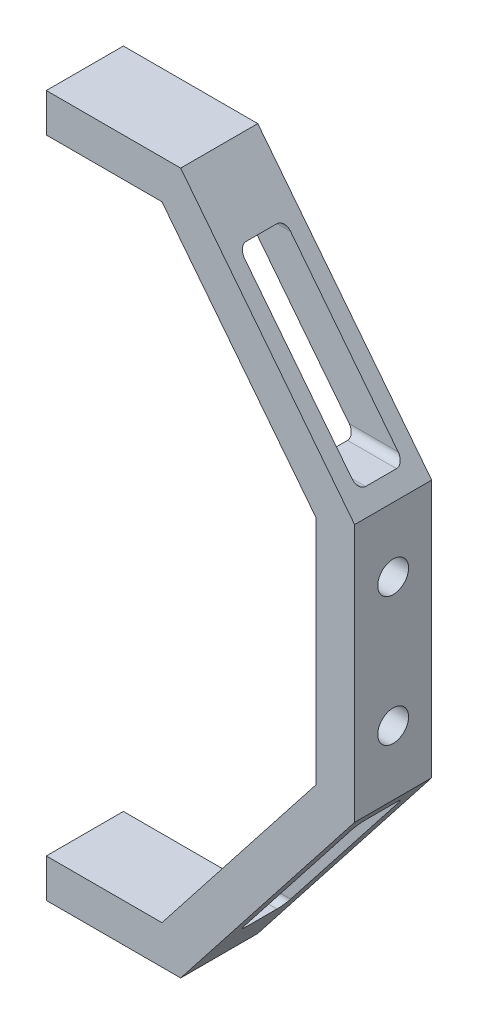
ISO-10303-21;
HEADER;
FILE_DESCRIPTION(('STEP AP214'),'2;1');
FILE_NAME('part.step','',(''),(''),'','','');
FILE_SCHEMA(('AUTOMOTIVE_DESIGN { 1 0 10303 214 1 1 1 1 }'));
ENDSEC;
DATA;
#1=APPLICATION_CONTEXT('core data for automotive mechanical design processes');
#2=APPLICATION_PROTOCOL_DEFINITION('international standard','automotive_design',2000,#1);
#3=PRODUCT_CONTEXT('',#1,'mechanical');
#4=PRODUCT('Part','Part','',(#3));
#5=PRODUCT_RELATED_PRODUCT_CATEGORY('part','',(#4));
#6=PRODUCT_DEFINITION_FORMATION('','',#4);
#7=PRODUCT_DEFINITION_CONTEXT('part definition',#1,'design');
#8=PRODUCT_DEFINITION('design','',#6,#7);
#9=PRODUCT_DEFINITION_SHAPE('','',#8);
#10=(LENGTH_UNIT() NAMED_UNIT(*) SI_UNIT(.MILLI.,.METRE.));
#11=(NAMED_UNIT(*) PLANE_ANGLE_UNIT() SI_UNIT($,.RADIAN.));
#12=(NAMED_UNIT(*) SI_UNIT($,.STERADIAN.) SOLID_ANGLE_UNIT());
#13=UNCERTAINTY_MEASURE_WITH_UNIT(LENGTH_MEASURE(1.E-05),#10,'distance_accuracy_value','');
#14=(GEOMETRIC_REPRESENTATION_CONTEXT(3) GLOBAL_UNCERTAINTY_ASSIGNED_CONTEXT((#13)) GLOBAL_UNIT_ASSIGNED_CONTEXT((#10,
#11,#12)) REPRESENTATION_CONTEXT('',''));
#15=CARTESIAN_POINT('',(0.,0.,0.));
#16=DIRECTION('',(0.,0.,1.));
#17=DIRECTION('',(1.,0.,0.));
#18=AXIS2_PLACEMENT_3D('',#15,#16,#17);
#19=CARTESIAN_POINT('',(0.,177.,20.));
#20=DIRECTION('',(0.,-1.,0.));
#21=DIRECTION('',(0.,0.,-1.));
#22=AXIS2_PLACEMENT_3D('',#19,#20,#21);
#23=PLANE('',#22);
#24=DIRECTION('',(-1.,0.,0.));
#25=VECTOR('',#24,1.);
#26=CARTESIAN_POINT('',(0.,177.,0.));
#27=LINE('',#26,#25);
#28=CARTESIAN_POINT('',(34.8657101357638,177.,0.));
#29=VERTEX_POINT('',#28);
#30=CARTESIAN_POINT('',(0.,177.,0.));
#31=VERTEX_POINT('',#30);
#32=EDGE_CURVE('E293',#29,#31,#27,.T.);
#33=ORIENTED_EDGE('',*,*,#32,.T.);
#34=DIRECTION('',(0.,0.,-1.));
#35=VECTOR('',#34,1.);
#36=CARTESIAN_POINT('',(0.,177.,20.));
#37=LINE('',#36,#35);
#38=CARTESIAN_POINT('',(0.,177.,20.));
#39=VERTEX_POINT('',#38);
#40=EDGE_CURVE('E384',#39,#31,#37,.T.);
#41=ORIENTED_EDGE('',*,*,#40,.F.);
#42=DIRECTION('',(-1.,0.,0.));
#43=VECTOR('',#42,1.);
#44=CARTESIAN_POINT('',(0.,177.,20.));
#45=LINE('',#44,#43);
#46=CARTESIAN_POINT('',(34.8657101357638,177.,20.));
#47=VERTEX_POINT('',#46);
#48=EDGE_CURVE('E302',#47,#39,#45,.T.);
#49=ORIENTED_EDGE('',*,*,#48,.F.);
#50=DIRECTION('',(0.,0.,-1.));
#51=VECTOR('',#50,1.);
#52=CARTESIAN_POINT('',(34.8657101357638,177.,20.));
#53=LINE('',#52,#51);
#54=EDGE_CURVE('E328',#47,#29,#53,.T.);
#55=ORIENTED_EDGE('',*,*,#54,.T.);
#56=EDGE_LOOP('',(#33,#41,#49,#55));
#57=FACE_BOUND('',#56,.T.);
#58=ADVANCED_FACE('F40',(#57),#23,.F.);
#59=CARTESIAN_POINT('',(0.,177.,20.));
#60=DIRECTION('',(1.,0.,0.));
#61=DIRECTION('',(0.,1.,0.));
#62=AXIS2_PLACEMENT_3D('',#59,#60,#61);
#63=PLANE('',#62);
#64=CARTESIAN_POINT('',(0.,172.,10.));
#65=DIRECTION('',(-1.,0.,0.));
#66=DIRECTION('',(0.,-1.,0.));
#67=AXIS2_PLACEMENT_3D('',#64,#65,#66);
#68=CIRCLE('',#67,4.);
#69=CARTESIAN_POINT('',(0.,168.,10.));
#70=VERTEX_POINT('',#69);
#71=EDGE_CURVE('E294',#70,#70,#68,.T.);
#72=ORIENTED_EDGE('',*,*,#71,.F.);
#73=EDGE_LOOP('',(#72));
#74=FACE_BOUND('',#73,.T.);
#75=DIRECTION('',(0.,-1.,0.));
#76=VECTOR('',#75,1.);
#77=CARTESIAN_POINT('',(0.,177.,0.));
#78=LINE('',#77,#76);
#79=CARTESIAN_POINT('',(0.,167.,0.));
#80=VERTEX_POINT('',#79);
#81=EDGE_CURVE('E331',#31,#80,#78,.T.);
#82=ORIENTED_EDGE('',*,*,#81,.T.);
#83=DIRECTION('',(0.,0.,-1.));
#84=VECTOR('',#83,1.);
#85=CARTESIAN_POINT('',(0.,167.,20.));
#86=LINE('',#85,#84);
#87=CARTESIAN_POINT('',(0.,167.,20.));
#88=VERTEX_POINT('',#87);
#89=EDGE_CURVE('E381',#88,#80,#86,.T.);
#90=ORIENTED_EDGE('',*,*,#89,.F.);
#91=DIRECTION('',(0.,-1.,0.));
#92=VECTOR('',#91,1.);
#93=CARTESIAN_POINT('',(0.,177.,20.));
#94=LINE('',#93,#92);
#95=EDGE_CURVE('E305',#39,#88,#94,.T.);
#96=ORIENTED_EDGE('',*,*,#95,.F.);
#97=ORIENTED_EDGE('',*,*,#40,.T.);
#98=EDGE_LOOP('',(#82,#90,#96,#97));
#99=FACE_BOUND('',#98,.T.);
#100=ADVANCED_FACE('F517',(#74,#99),#63,.F.);
#101=CARTESIAN_POINT('',(0.,167.,20.));
#102=DIRECTION('',(0.,1.,0.));
#103=DIRECTION('',(0.,0.,1.));
#104=AXIS2_PLACEMENT_3D('',#101,#102,#103);
#105=PLANE('',#104);
#106=DIRECTION('',(1.,0.,0.));
#107=VECTOR('',#106,1.);
#108=CARTESIAN_POINT('',(0.,167.,0.));
#109=LINE('',#108,#107);
#110=CARTESIAN_POINT('',(30.,167.,0.));
#111=VERTEX_POINT('',#110);
#112=EDGE_CURVE('E333',#80,#111,#109,.T.);
#113=ORIENTED_EDGE('',*,*,#112,.T.);
#114=DIRECTION('',(0.,0.,-1.));
#115=VECTOR('',#114,1.);
#116=CARTESIAN_POINT('',(30.,167.,20.));
#117=LINE('',#116,#115);
#118=CARTESIAN_POINT('',(30.,167.,20.));
#119=VERTEX_POINT('',#118);
#120=EDGE_CURVE('E378',#119,#111,#117,.T.);
#121=ORIENTED_EDGE('',*,*,#120,.F.);
#122=DIRECTION('',(1.,0.,0.));
#123=VECTOR('',#122,1.);
#124=CARTESIAN_POINT('',(0.,167.,20.));
#125=LINE('',#124,#123);
#126=EDGE_CURVE('E308',#88,#119,#125,.T.);
#127=ORIENTED_EDGE('',*,*,#126,.F.);
#128=ORIENTED_EDGE('',*,*,#89,.T.);
#129=EDGE_LOOP('',(#113,#121,#127,#128));
#130=FACE_BOUND('',#129,.T.);
#131=ADVANCED_FACE('F522',(#130),#105,.F.);
#132=CARTESIAN_POINT('',(30.,167.,20.));
#133=DIRECTION('',(0.786853417355905,0.617139935181102,0.));
#134=DIRECTION('',(-0.617139935181102,0.786853417355905,0.));
#135=AXIS2_PLACEMENT_3D('',#132,#133,#134);
#136=PLANE('',#135);
#137=DIRECTION('',(0.617139935181102,-0.786853417355905,0.));
#138=VECTOR('',#137,1.);
#139=CARTESIAN_POINT('',(30.,167.,16.));
#140=LINE('',#139,#138);
#141=CARTESIAN_POINT('',(34.7058823529412,161.,16.));
#142=VERTEX_POINT('',#141);
#143=CARTESIAN_POINT('',(62.5852702563931,125.453780423099,16.));
#144=VERTEX_POINT('',#143);
#145=EDGE_CURVE('E247',#142,#144,#140,.T.);
#146=ORIENTED_EDGE('',*,*,#145,.T.);
#147=CARTESIAN_POINT('',(62.5852702563931,125.453780423099,14.));
#148=DIRECTION('',(0.786853417355905,0.617139935181102,0.));
#149=DIRECTION('',(0.617139935181102,-0.786853417355905,0.));
#150=AXIS2_PLACEMENT_3D('',#147,#148,#149);
#151=ELLIPSE('',#150,2.54176947813315,2.);
#152=CARTESIAN_POINT('',(64.1538977073735,123.453780423099,14.));
#153=VERTEX_POINT('',#152);
#154=EDGE_CURVE('E236',#144,#153,#151,.T.);
#155=ORIENTED_EDGE('',*,*,#154,.T.);
#156=DIRECTION('',(0.,0.,-1.));
#157=VECTOR('',#156,1.);
#158=CARTESIAN_POINT('',(64.1538977073735,123.453780423099,20.));
#159=LINE('',#158,#157);
#160=CARTESIAN_POINT('',(64.1538977073735,123.453780423099,6.00000000000001));
#161=VERTEX_POINT('',#160);
#162=EDGE_CURVE('E222',#153,#161,#159,.T.);
#163=ORIENTED_EDGE('',*,*,#162,.T.);
#164=CARTESIAN_POINT('',(62.5852702563931,125.453780423099,5.99999999999999));
#165=DIRECTION('',(0.786853417355905,0.617139935181102,0.));
#166=DIRECTION('',(0.617139935181102,-0.786853417355905,0.));
#167=AXIS2_PLACEMENT_3D('',#164,#165,#166);
#168=ELLIPSE('',#167,2.54176947813315,2.);
#169=CARTESIAN_POINT('',(62.5852702563931,125.453780423099,3.99999999999999));
#170=VERTEX_POINT('',#169);
#171=EDGE_CURVE('E230',#161,#170,#168,.T.);
#172=ORIENTED_EDGE('',*,*,#171,.T.);
#173=DIRECTION('',(-0.617139935181102,0.786853417355905,0.));
#174=VECTOR('',#173,1.);
#175=CARTESIAN_POINT('',(30.,167.,4.));
#176=LINE('',#175,#174);
#177=CARTESIAN_POINT('',(34.7058823529412,161.,4.));
#178=VERTEX_POINT('',#177);
#179=EDGE_CURVE('E447',#170,#178,#176,.T.);
#180=ORIENTED_EDGE('',*,*,#179,.T.);
#181=CARTESIAN_POINT('',(34.7058823529412,161.,6.));
#182=DIRECTION('',(0.786853417355905,0.617139935181102,0.));
#183=DIRECTION('',(0.617139935181102,-0.786853417355905,0.));
#184=AXIS2_PLACEMENT_3D('',#181,#182,#183);
#185=ELLIPSE('',#184,2.54176947813315,2.);
#186=CARTESIAN_POINT('',(33.1372549019608,163.,6.00000000000001));
#187=VERTEX_POINT('',#186);
#188=EDGE_CURVE('E450',#178,#187,#185,.T.);
#189=ORIENTED_EDGE('',*,*,#188,.T.);
#190=DIRECTION('',(0.,0.,1.));
#191=VECTOR('',#190,1.);
#192=CARTESIAN_POINT('',(33.1372549019608,163.,20.));
#193=LINE('',#192,#191);
#194=CARTESIAN_POINT('',(33.1372549019608,163.,14.));
#195=VERTEX_POINT('',#194);
#196=EDGE_CURVE('E453',#187,#195,#193,.T.);
#197=ORIENTED_EDGE('',*,*,#196,.T.);
#198=CARTESIAN_POINT('',(34.7058823529412,161.,14.));
#199=DIRECTION('',(0.786853417355905,0.617139935181102,0.));
#200=DIRECTION('',(0.617139935181102,-0.786853417355905,0.));
#201=AXIS2_PLACEMENT_3D('',#198,#199,#200);
#202=ELLIPSE('',#201,2.54176947813315,2.);
#203=EDGE_CURVE('E253',#195,#142,#202,.T.);
#204=ORIENTED_EDGE('',*,*,#203,.T.);
#205=EDGE_LOOP('',(#146,#155,#163,#172,#180,#189,#197,#204));
#206=FACE_BOUND('',#205,.T.);
#207=DIRECTION('',(0.617139935181102,-0.786853417355905,0.));
#208=VECTOR('',#207,1.);
#209=CARTESIAN_POINT('',(30.,167.,0.));
#210=LINE('',#209,#208);
#211=CARTESIAN_POINT('',(70.,116.,0.));
#212=VERTEX_POINT('',#211);
#213=EDGE_CURVE('E335',#111,#212,#210,.T.);
#214=ORIENTED_EDGE('',*,*,#213,.T.);
#215=DIRECTION('',(0.,0.,-1.));
#216=VECTOR('',#215,1.);
#217=CARTESIAN_POINT('',(70.,116.,20.));
#218=LINE('',#217,#216);
#219=CARTESIAN_POINT('',(70.,116.,20.));
#220=VERTEX_POINT('',#219);
#221=EDGE_CURVE('E375',#220,#212,#218,.T.);
#222=ORIENTED_EDGE('',*,*,#221,.F.);
#223=DIRECTION('',(0.617139935181102,-0.786853417355905,0.));
#224=VECTOR('',#223,1.);
#225=CARTESIAN_POINT('',(30.,167.,20.));
#226=LINE('',#225,#224);
#227=EDGE_CURVE('E310',#119,#220,#226,.T.);
#228=ORIENTED_EDGE('',*,*,#227,.F.);
#229=ORIENTED_EDGE('',*,*,#120,.T.);
#230=EDGE_LOOP('',(#214,#222,#228,#229));
#231=FACE_BOUND('',#230,.T.);
#232=ADVANCED_FACE('F244',(#206,#231),#136,.F.);
#233=CARTESIAN_POINT('',(70.,116.,20.));
#234=DIRECTION('',(1.,0.,0.));
#235=DIRECTION('',(0.,0.,-1.));
#236=AXIS2_PLACEMENT_3D('',#233,#234,#235);
#237=PLANE('',#236);
#238=CARTESIAN_POINT('',(70.,102.726890211549,10.));
#239=DIRECTION('',(1.,0.,0.));
#240=DIRECTION('',(0.,0.,-1.));
#241=AXIS2_PLACEMENT_3D('',#238,#239,#240);
#242=CIRCLE('',#241,4.);
#243=CARTESIAN_POINT('',(70.,102.726890211549,6.));
#244=VERTEX_POINT('',#243);
#245=EDGE_CURVE('E286',#244,#244,#242,.T.);
#246=ORIENTED_EDGE('',*,*,#245,.T.);
#247=EDGE_LOOP('',(#246));
#248=FACE_BOUND('',#247,.T.);
#249=CARTESIAN_POINT('',(70.,69.2731097884506,10.));
#250=DIRECTION('',(1.,0.,0.));
#251=DIRECTION('',(0.,0.,-1.));
#252=AXIS2_PLACEMENT_3D('',#249,#250,#251);
#253=CIRCLE('',#252,4.);
#254=CARTESIAN_POINT('',(70.,69.2731097884506,6.));
#255=VERTEX_POINT('',#254);
#256=EDGE_CURVE('E281',#255,#255,#253,.T.);
#257=ORIENTED_EDGE('',*,*,#256,.T.);
#258=EDGE_LOOP('',(#257));
#259=FACE_BOUND('',#258,.T.);
#260=DIRECTION('',(0.,-1.,0.));
#261=VECTOR('',#260,1.);
#262=CARTESIAN_POINT('',(70.,116.,0.));
#263=LINE('',#262,#261);
#264=CARTESIAN_POINT('',(70.,56.,0.));
#265=VERTEX_POINT('',#264);
#266=EDGE_CURVE('E337',#212,#265,#263,.T.);
#267=ORIENTED_EDGE('',*,*,#266,.T.);
#268=DIRECTION('',(0.,0.,-1.));
#269=VECTOR('',#268,1.);
#270=CARTESIAN_POINT('',(70.,56.,20.));
#271=LINE('',#270,#269);
#272=CARTESIAN_POINT('',(70.,56.,20.));
#273=VERTEX_POINT('',#272);
#274=EDGE_CURVE('E372',#273,#265,#271,.T.);
#275=ORIENTED_EDGE('',*,*,#274,.F.);
#276=DIRECTION('',(0.,-1.,0.));
#277=VECTOR('',#276,1.);
#278=CARTESIAN_POINT('',(70.,116.,20.));
#279=LINE('',#278,#277);
#280=EDGE_CURVE('E312',#220,#273,#279,.T.);
#281=ORIENTED_EDGE('',*,*,#280,.F.);
#282=ORIENTED_EDGE('',*,*,#221,.T.);
#283=EDGE_LOOP('',(#267,#275,#281,#282));
#284=FACE_BOUND('',#283,.T.);
#285=ADVANCED_FACE('F571',(#248,#259,#284),#237,.F.);
#286=CARTESIAN_POINT('',(30.,5.,20.));
#287=DIRECTION('',(0.786853417355905,-0.617139935181102,0.));
#288=DIRECTION('',(0.617139935181102,0.786853417355905,0.));
#289=AXIS2_PLACEMENT_3D('',#286,#287,#288);
#290=PLANE('',#289);
#291=DIRECTION('',(0.,0.,1.));
#292=VECTOR('',#291,1.);
#293=CARTESIAN_POINT('',(64.1538977073735,48.5462195769012,20.));
#294=LINE('',#293,#292);
#295=CARTESIAN_POINT('',(64.1538977073735,48.5462195769012,6.00000000000001));
#296=VERTEX_POINT('',#295);
#297=CARTESIAN_POINT('',(64.1538977073735,48.5462195769012,14.));
#298=VERTEX_POINT('',#297);
#299=EDGE_CURVE('E271',#296,#298,#294,.T.);
#300=ORIENTED_EDGE('',*,*,#299,.T.);
#301=CARTESIAN_POINT('',(62.5852702563931,46.5462195769012,14.));
#302=DIRECTION('',(0.786853417355905,-0.617139935181102,0.));
#303=DIRECTION('',(0.617139935181102,0.786853417355905,0.));
#304=AXIS2_PLACEMENT_3D('',#301,#302,#303);
#305=ELLIPSE('',#304,2.54176947813315,2.);
#306=CARTESIAN_POINT('',(62.5852702563931,46.5462195769012,16.));
#307=VERTEX_POINT('',#306);
#308=EDGE_CURVE('E274',#298,#307,#305,.T.);
#309=ORIENTED_EDGE('',*,*,#308,.T.);
#310=DIRECTION('',(-0.617139935181102,-0.786853417355905,0.));
#311=VECTOR('',#310,1.);
#312=CARTESIAN_POINT('',(30.,5.,16.));
#313=LINE('',#312,#311);
#314=CARTESIAN_POINT('',(34.7058823529412,11.,16.));
#315=VERTEX_POINT('',#314);
#316=EDGE_CURVE('E248',#307,#315,#313,.T.);
#317=ORIENTED_EDGE('',*,*,#316,.T.);
#318=CARTESIAN_POINT('',(34.7058823529412,11.,14.));
#319=DIRECTION('',(0.786853417355905,-0.617139935181102,0.));
#320=DIRECTION('',(0.617139935181102,0.786853417355905,0.));
#321=AXIS2_PLACEMENT_3D('',#318,#319,#320);
#322=ELLIPSE('',#321,2.54176947813315,2.);
#323=CARTESIAN_POINT('',(33.1372549019608,9.00000000000001,14.));
#324=VERTEX_POINT('',#323);
#325=EDGE_CURVE('E251',#315,#324,#322,.T.);
#326=ORIENTED_EDGE('',*,*,#325,.T.);
#327=DIRECTION('',(0.,0.,-1.));
#328=VECTOR('',#327,1.);
#329=CARTESIAN_POINT('',(33.1372549019608,9.00000000000001,20.));
#330=LINE('',#329,#328);
#331=CARTESIAN_POINT('',(33.1372549019608,9.00000000000001,6.00000000000002));
#332=VERTEX_POINT('',#331);
#333=EDGE_CURVE('E259',#324,#332,#330,.T.);
#334=ORIENTED_EDGE('',*,*,#333,.T.);
#335=CARTESIAN_POINT('',(34.7058823529412,11.,6.));
#336=DIRECTION('',(0.786853417355905,-0.617139935181102,0.));
#337=DIRECTION('',(0.617139935181102,0.786853417355905,0.));
#338=AXIS2_PLACEMENT_3D('',#335,#336,#337);
#339=ELLIPSE('',#338,2.54176947813315,2.);
#340=CARTESIAN_POINT('',(34.7058823529412,11.,4.));
#341=VERTEX_POINT('',#340);
#342=EDGE_CURVE('E262',#332,#341,#339,.T.);
#343=ORIENTED_EDGE('',*,*,#342,.T.);
#344=DIRECTION('',(0.617139935181102,0.786853417355905,0.));
#345=VECTOR('',#344,1.);
#346=CARTESIAN_POINT('',(30.,5.,4.));
#347=LINE('',#346,#345);
#348=CARTESIAN_POINT('',(62.5852702563931,46.5462195769012,3.99999999999999));
#349=VERTEX_POINT('',#348);
#350=EDGE_CURVE('E265',#341,#349,#347,.T.);
#351=ORIENTED_EDGE('',*,*,#350,.T.);
#352=CARTESIAN_POINT('',(62.5852702563931,46.5462195769012,5.99999999999999));
#353=DIRECTION('',(0.786853417355905,-0.617139935181102,0.));
#354=DIRECTION('',(0.617139935181102,0.786853417355905,0.));
#355=AXIS2_PLACEMENT_3D('',#352,#353,#354);
#356=ELLIPSE('',#355,2.54176947813315,2.);
#357=EDGE_CURVE('E268',#349,#296,#356,.T.);
#358=ORIENTED_EDGE('',*,*,#357,.T.);
#359=EDGE_LOOP('',(#300,#309,#317,#326,#334,#343,#351,#358));
#360=FACE_BOUND('',#359,.T.);
#361=DIRECTION('',(-0.617139935181102,-0.786853417355905,0.));
#362=VECTOR('',#361,1.);
#363=CARTESIAN_POINT('',(30.,5.,0.));
#364=LINE('',#363,#362);
#365=CARTESIAN_POINT('',(30.,5.,0.));
#366=VERTEX_POINT('',#365);
#367=EDGE_CURVE('E339',#265,#366,#364,.T.);
#368=ORIENTED_EDGE('',*,*,#367,.T.);
#369=DIRECTION('',(0.,0.,-1.));
#370=VECTOR('',#369,1.);
#371=CARTESIAN_POINT('',(30.,5.,20.));
#372=LINE('',#371,#370);
#373=CARTESIAN_POINT('',(30.,5.,20.));
#374=VERTEX_POINT('',#373);
#375=EDGE_CURVE('E369',#374,#366,#372,.T.);
#376=ORIENTED_EDGE('',*,*,#375,.F.);
#377=DIRECTION('',(-0.617139935181102,-0.786853417355905,0.));
#378=VECTOR('',#377,1.);
#379=CARTESIAN_POINT('',(30.,5.,20.));
#380=LINE('',#379,#378);
#381=EDGE_CURVE('E314',#273,#374,#380,.T.);
#382=ORIENTED_EDGE('',*,*,#381,.F.);
#383=ORIENTED_EDGE('',*,*,#274,.T.);
#384=EDGE_LOOP('',(#368,#376,#382,#383));
#385=FACE_BOUND('',#384,.T.);
#386=ADVANCED_FACE('F498',(#360,#385),#290,.F.);
#387=CARTESIAN_POINT('',(0.,5.,20.));
#388=DIRECTION('',(0.,-1.,0.));
#389=DIRECTION('',(0.,0.,-1.));
#390=AXIS2_PLACEMENT_3D('',#387,#388,#389);
#391=PLANE('',#390);
#392=DIRECTION('',(-1.,0.,0.));
#393=VECTOR('',#392,1.);
#394=CARTESIAN_POINT('',(0.,5.,0.));
#395=LINE('',#394,#393);
#396=CARTESIAN_POINT('',(0.,5.,0.));
#397=VERTEX_POINT('',#396);
#398=EDGE_CURVE('E341',#366,#397,#395,.T.);
#399=ORIENTED_EDGE('',*,*,#398,.T.);
#400=DIRECTION('',(0.,0.,-1.));
#401=VECTOR('',#400,1.);
#402=CARTESIAN_POINT('',(0.,5.,20.));
#403=LINE('',#402,#401);
#404=CARTESIAN_POINT('',(0.,5.,20.));
#405=VERTEX_POINT('',#404);
#406=EDGE_CURVE('E366',#405,#397,#403,.T.);
#407=ORIENTED_EDGE('',*,*,#406,.F.);
#408=DIRECTION('',(-1.,0.,0.));
#409=VECTOR('',#408,1.);
#410=CARTESIAN_POINT('',(0.,5.,20.));
#411=LINE('',#410,#409);
#412=EDGE_CURVE('E316',#374,#405,#411,.T.);
#413=ORIENTED_EDGE('',*,*,#412,.F.);
#414=ORIENTED_EDGE('',*,*,#375,.T.);
#415=EDGE_LOOP('',(#399,#407,#413,#414));
#416=FACE_BOUND('',#415,.T.);
#417=ADVANCED_FACE('F564',(#416),#391,.F.);
#418=CARTESIAN_POINT('',(0.,-5.,20.));
#419=DIRECTION('',(1.,0.,0.));
#420=DIRECTION('',(0.,1.,0.));
#421=AXIS2_PLACEMENT_3D('',#418,#419,#420);
#422=PLANE('',#421);
#423=CARTESIAN_POINT('',(0.,0.,10.));
#424=DIRECTION('',(-1.,0.,0.));
#425=DIRECTION('',(0.,1.,0.));
#426=AXIS2_PLACEMENT_3D('',#423,#424,#425);
#427=CIRCLE('',#426,4.);
#428=CARTESIAN_POINT('',(0.,4.,10.));
#429=VERTEX_POINT('',#428);
#430=EDGE_CURVE('E297',#429,#429,#427,.T.);
#431=ORIENTED_EDGE('',*,*,#430,.F.);
#432=EDGE_LOOP('',(#431));
#433=FACE_BOUND('',#432,.T.);
#434=DIRECTION('',(0.,-1.,0.));
#435=VECTOR('',#434,1.);
#436=CARTESIAN_POINT('',(0.,-5.,0.));
#437=LINE('',#436,#435);
#438=CARTESIAN_POINT('',(0.,-5.,0.));
#439=VERTEX_POINT('',#438);
#440=EDGE_CURVE('E343',#397,#439,#437,.T.);
#441=ORIENTED_EDGE('',*,*,#440,.T.);
#442=DIRECTION('',(0.,0.,-1.));
#443=VECTOR('',#442,1.);
#444=CARTESIAN_POINT('',(0.,-5.,20.));
#445=LINE('',#444,#443);
#446=CARTESIAN_POINT('',(0.,-5.,20.));
#447=VERTEX_POINT('',#446);
#448=EDGE_CURVE('E363',#447,#439,#445,.T.);
#449=ORIENTED_EDGE('',*,*,#448,.F.);
#450=DIRECTION('',(0.,-1.,0.));
#451=VECTOR('',#450,1.);
#452=CARTESIAN_POINT('',(0.,-5.,20.));
#453=LINE('',#452,#451);
#454=EDGE_CURVE('E318',#405,#447,#453,.T.);
#455=ORIENTED_EDGE('',*,*,#454,.F.);
#456=ORIENTED_EDGE('',*,*,#406,.T.);
#457=EDGE_LOOP('',(#441,#449,#455,#456));
#458=FACE_BOUND('',#457,.T.);
#459=ADVANCED_FACE('F558',(#433,#458),#422,.F.);
#460=CARTESIAN_POINT('',(0.,-5.,20.));
#461=DIRECTION('',(0.,1.,0.));
#462=DIRECTION('',(0.,0.,1.));
#463=AXIS2_PLACEMENT_3D('',#460,#461,#462);
#464=PLANE('',#463);
#465=DIRECTION('',(1.,0.,0.));
#466=VECTOR('',#465,1.);
#467=CARTESIAN_POINT('',(0.,-5.,0.));
#468=LINE('',#467,#466);
#469=CARTESIAN_POINT('',(34.8657101357638,-5.,0.));
#470=VERTEX_POINT('',#469);
#471=EDGE_CURVE('E345',#439,#470,#468,.T.);
#472=ORIENTED_EDGE('',*,*,#471,.T.);
#473=DIRECTION('',(0.,0.,-1.));
#474=VECTOR('',#473,1.);
#475=CARTESIAN_POINT('',(34.8657101357638,-5.,20.));
#476=LINE('',#475,#474);
#477=CARTESIAN_POINT('',(34.8657101357638,-5.,20.));
#478=VERTEX_POINT('',#477);
#479=EDGE_CURVE('E360',#478,#470,#476,.T.);
#480=ORIENTED_EDGE('',*,*,#479,.F.);
#481=DIRECTION('',(1.,0.,0.));
#482=VECTOR('',#481,1.);
#483=CARTESIAN_POINT('',(0.,-5.,20.));
#484=LINE('',#483,#482);
#485=EDGE_CURVE('E320',#447,#478,#484,.T.);
#486=ORIENTED_EDGE('',*,*,#485,.F.);
#487=ORIENTED_EDGE('',*,*,#448,.T.);
#488=EDGE_LOOP('',(#472,#480,#486,#487));
#489=FACE_BOUND('',#488,.T.);
#490=ADVANCED_FACE('F554',(#489),#464,.F.);
#491=CARTESIAN_POINT('',(34.8657101357638,-5.,20.));
#492=DIRECTION('',(-0.786853417355905,0.617139935181102,0.));
#493=DIRECTION('',(-0.617139935181102,-0.786853417355905,0.));
#494=AXIS2_PLACEMENT_3D('',#491,#492,#493);
#495=PLANE('',#494);
#496=DIRECTION('',(0.617139935181102,0.786853417355905,0.));
#497=VECTOR('',#496,1.);
#498=CARTESIAN_POINT('',(34.8657101357638,-5.,16.));
#499=LINE('',#498,#497);
#500=CARTESIAN_POINT('',(47.4147297436069,11.,16.));
#501=VERTEX_POINT('',#500);
#502=CARTESIAN_POINT('',(75.2941176470588,46.5462195769012,16.));
#503=VERTEX_POINT('',#502);
#504=EDGE_CURVE('E408',#501,#503,#499,.T.);
#505=ORIENTED_EDGE('',*,*,#504,.T.);
#506=CARTESIAN_POINT('',(75.2941176470588,46.5462195769012,14.));
#507=DIRECTION('',(-0.786853417355905,0.617139935181102,0.));
#508=DIRECTION('',(0.617139935181102,0.786853417355905,0.));
#509=AXIS2_PLACEMENT_3D('',#506,#507,#508);
#510=ELLIPSE('',#509,2.54176947813315,2.);
#511=CARTESIAN_POINT('',(76.8627450980392,48.5462195769012,14.));
#512=VERTEX_POINT('',#511);
#513=EDGE_CURVE('E11',#503,#512,#510,.T.);
#514=ORIENTED_EDGE('',*,*,#513,.T.);
#515=DIRECTION('',(0.,0.,-1.));
#516=VECTOR('',#515,1.);
#517=CARTESIAN_POINT('',(76.8627450980392,48.5462195769012,20.));
#518=LINE('',#517,#516);
#519=CARTESIAN_POINT('',(76.8627450980392,48.5462195769012,6.00000000000001));
#520=VERTEX_POINT('',#519);
#521=EDGE_CURVE('E47',#512,#520,#518,.T.);
#522=ORIENTED_EDGE('',*,*,#521,.T.);
#523=CARTESIAN_POINT('',(75.2941176470588,46.5462195769012,5.99999999999999));
#524=DIRECTION('',(-0.786853417355905,0.617139935181102,0.));
#525=DIRECTION('',(0.617139935181102,0.786853417355905,0.));
#526=AXIS2_PLACEMENT_3D('',#523,#524,#525);
#527=ELLIPSE('',#526,2.54176947813315,2.);
#528=CARTESIAN_POINT('',(75.2941176470588,46.5462195769012,3.99999999999999));
#529=VERTEX_POINT('',#528);
#530=EDGE_CURVE('E423',#520,#529,#527,.T.);
#531=ORIENTED_EDGE('',*,*,#530,.T.);
#532=DIRECTION('',(-0.617139935181102,-0.786853417355905,0.));
#533=VECTOR('',#532,1.);
#534=CARTESIAN_POINT('',(34.8657101357638,-5.00000000000001,4.));
#535=LINE('',#534,#533);
#536=CARTESIAN_POINT('',(47.4147297436069,11.,4.));
#537=VERTEX_POINT('',#536);
#538=EDGE_CURVE('E420',#529,#537,#535,.T.);
#539=ORIENTED_EDGE('',*,*,#538,.T.);
#540=CARTESIAN_POINT('',(47.4147297436069,11.,6.));
#541=DIRECTION('',(-0.786853417355905,0.617139935181102,0.));
#542=DIRECTION('',(0.617139935181102,0.786853417355905,0.));
#543=AXIS2_PLACEMENT_3D('',#540,#541,#542);
#544=ELLIPSE('',#543,2.54176947813315,2.);
#545=CARTESIAN_POINT('',(45.8461022926265,9.00000000000001,6.00000000000002));
#546=VERTEX_POINT('',#545);
#547=EDGE_CURVE('E417',#537,#546,#544,.T.);
#548=ORIENTED_EDGE('',*,*,#547,.T.);
#549=DIRECTION('',(0.,0.,1.));
#550=VECTOR('',#549,1.);
#551=CARTESIAN_POINT('',(45.8461022926265,9.00000000000001,20.));
#552=LINE('',#551,#550);
#553=CARTESIAN_POINT('',(45.8461022926265,9.00000000000001,14.));
#554=VERTEX_POINT('',#553);
#555=EDGE_CURVE('E414',#546,#554,#552,.T.);
#556=ORIENTED_EDGE('',*,*,#555,.T.);
#557=CARTESIAN_POINT('',(47.4147297436069,11.,14.));
#558=DIRECTION('',(-0.786853417355905,0.617139935181102,0.));
#559=DIRECTION('',(0.617139935181102,0.786853417355905,0.));
#560=AXIS2_PLACEMENT_3D('',#557,#558,#559);
#561=ELLIPSE('',#560,2.54176947813315,2.);
#562=EDGE_CURVE('E411',#554,#501,#561,.T.);
#563=ORIENTED_EDGE('',*,*,#562,.T.);
#564=EDGE_LOOP('',(#505,#514,#522,#531,#539,#548,#556,#563));
#565=FACE_BOUND('',#564,.T.);
#566=DIRECTION('',(0.617139935181102,0.786853417355905,0.));
#567=VECTOR('',#566,1.);
#568=CARTESIAN_POINT('',(34.8657101357638,-5.,0.));
#569=LINE('',#568,#567);
#570=CARTESIAN_POINT('',(80.,52.5462195769012,0.));
#571=VERTEX_POINT('',#570);
#572=EDGE_CURVE('E347',#470,#571,#569,.T.);
#573=ORIENTED_EDGE('',*,*,#572,.T.);
#574=DIRECTION('',(0.,0.,-1.));
#575=VECTOR('',#574,1.);
#576=CARTESIAN_POINT('',(80.,52.5462195769012,20.));
#577=LINE('',#576,#575);
#578=CARTESIAN_POINT('',(80.,52.5462195769012,20.));
#579=VERTEX_POINT('',#578);
#580=EDGE_CURVE('E357',#579,#571,#577,.T.);
#581=ORIENTED_EDGE('',*,*,#580,.F.);
#582=DIRECTION('',(0.617139935181102,0.786853417355905,0.));
#583=VECTOR('',#582,1.);
#584=CARTESIAN_POINT('',(34.8657101357638,-5.,20.));
#585=LINE('',#584,#583);
#586=EDGE_CURVE('E322',#478,#579,#585,.T.);
#587=ORIENTED_EDGE('',*,*,#586,.F.);
#588=ORIENTED_EDGE('',*,*,#479,.T.);
#589=EDGE_LOOP('',(#573,#581,#587,#588));
#590=FACE_BOUND('',#589,.T.);
#591=ADVANCED_FACE('F427',(#565,#590),#495,.F.);
#592=CARTESIAN_POINT('',(80.,119.453780423099,20.));
#593=DIRECTION('',(-1.,0.,0.));
#594=DIRECTION('',(0.,0.,1.));
#595=AXIS2_PLACEMENT_3D('',#592,#593,#594);
#596=PLANE('',#595);
#597=CARTESIAN_POINT('',(80.,102.726890211549,10.));
#598=DIRECTION('',(1.,0.,0.));
#599=DIRECTION('',(0.,0.,-1.));
#600=AXIS2_PLACEMENT_3D('',#597,#598,#599);
#601=CIRCLE('',#600,4.);
#602=CARTESIAN_POINT('',(80.,102.726890211549,6.));
#603=VERTEX_POINT('',#602);
#604=EDGE_CURVE('E278',#603,#603,#601,.T.);
#605=ORIENTED_EDGE('',*,*,#604,.F.);
#606=EDGE_LOOP('',(#605));
#607=FACE_BOUND('',#606,.T.);
#608=CARTESIAN_POINT('',(80.,69.2731097884506,10.));
#609=DIRECTION('',(1.,0.,0.));
#610=DIRECTION('',(0.,0.,-1.));
#611=AXIS2_PLACEMENT_3D('',#608,#609,#610);
#612=CIRCLE('',#611,4.);
#613=CARTESIAN_POINT('',(80.,69.2731097884506,6.));
#614=VERTEX_POINT('',#613);
#615=EDGE_CURVE('E277',#614,#614,#612,.T.);
#616=ORIENTED_EDGE('',*,*,#615,.F.);
#617=EDGE_LOOP('',(#616));
#618=FACE_BOUND('',#617,.T.);
#619=DIRECTION('',(0.,1.,0.));
#620=VECTOR('',#619,1.);
#621=CARTESIAN_POINT('',(80.,119.453780423099,0.));
#622=LINE('',#621,#620);
#623=CARTESIAN_POINT('',(80.,119.453780423099,0.));
#624=VERTEX_POINT('',#623);
#625=EDGE_CURVE('E349',#571,#624,#622,.T.);
#626=ORIENTED_EDGE('',*,*,#625,.T.);
#627=DIRECTION('',(0.,0.,-1.));
#628=VECTOR('',#627,1.);
#629=CARTESIAN_POINT('',(80.,119.453780423099,20.));
#630=LINE('',#629,#628);
#631=CARTESIAN_POINT('',(80.,119.453780423099,20.));
#632=VERTEX_POINT('',#631);
#633=EDGE_CURVE('E354',#632,#624,#630,.T.);
#634=ORIENTED_EDGE('',*,*,#633,.F.);
#635=DIRECTION('',(0.,1.,0.));
#636=VECTOR('',#635,1.);
#637=CARTESIAN_POINT('',(80.,119.453780423099,20.));
#638=LINE('',#637,#636);
#639=EDGE_CURVE('E324',#579,#632,#638,.T.);
#640=ORIENTED_EDGE('',*,*,#639,.F.);
#641=ORIENTED_EDGE('',*,*,#580,.T.);
#642=EDGE_LOOP('',(#626,#634,#640,#641));
#643=FACE_BOUND('',#642,.T.);
#644=ADVANCED_FACE('F545',(#607,#618,#643),#596,.F.);
#645=CARTESIAN_POINT('',(34.8657101357638,177.,20.));
#646=DIRECTION('',(-0.786853417355905,-0.617139935181102,0.));
#647=DIRECTION('',(0.617139935181102,-0.786853417355905,0.));
#648=AXIS2_PLACEMENT_3D('',#645,#646,#647);
#649=PLANE('',#648);
#650=DIRECTION('',(0.,0.,1.));
#651=VECTOR('',#650,1.);
#652=CARTESIAN_POINT('',(76.8627450980392,123.453780423099,20.));
#653=LINE('',#652,#651);
#654=CARTESIAN_POINT('',(76.8627450980392,123.453780423099,6.00000000000001));
#655=VERTEX_POINT('',#654);
#656=CARTESIAN_POINT('',(76.8627450980392,123.453780423099,14.));
#657=VERTEX_POINT('',#656);
#658=EDGE_CURVE('E387',#655,#657,#653,.T.);
#659=ORIENTED_EDGE('',*,*,#658,.T.);
#660=CARTESIAN_POINT('',(75.2941176470588,125.453780423099,14.));
#661=DIRECTION('',(-0.786853417355905,-0.617139935181102,0.));
#662=DIRECTION('',(0.617139935181102,-0.786853417355905,0.));
#663=AXIS2_PLACEMENT_3D('',#660,#661,#662);
#664=ELLIPSE('',#663,2.54176947813315,2.);
#665=CARTESIAN_POINT('',(75.2941176470588,125.453780423099,16.));
#666=VERTEX_POINT('',#665);
#667=EDGE_CURVE('E239',#657,#666,#664,.T.);
#668=ORIENTED_EDGE('',*,*,#667,.T.);
#669=DIRECTION('',(-0.617139935181102,0.786853417355905,0.));
#670=VECTOR('',#669,1.);
#671=CARTESIAN_POINT('',(34.8657101357638,177.,16.));
#672=LINE('',#671,#670);
#673=CARTESIAN_POINT('',(47.4147297436069,161.,16.));
#674=VERTEX_POINT('',#673);
#675=EDGE_CURVE('E404',#666,#674,#672,.T.);
#676=ORIENTED_EDGE('',*,*,#675,.T.);
#677=CARTESIAN_POINT('',(47.4147297436069,161.,14.));
#678=DIRECTION('',(-0.786853417355905,-0.617139935181102,0.));
#679=DIRECTION('',(0.617139935181102,-0.786853417355905,0.));
#680=AXIS2_PLACEMENT_3D('',#677,#678,#679);
#681=ELLIPSE('',#680,2.54176947813315,2.);
#682=CARTESIAN_POINT('',(45.8461022926265,163.,14.));
#683=VERTEX_POINT('',#682);
#684=EDGE_CURVE('E401',#674,#683,#681,.T.);
#685=ORIENTED_EDGE('',*,*,#684,.T.);
#686=DIRECTION('',(0.,0.,-1.));
#687=VECTOR('',#686,1.);
#688=CARTESIAN_POINT('',(45.8461022926265,163.,20.));
#689=LINE('',#688,#687);
#690=CARTESIAN_POINT('',(45.8461022926265,163.,6.00000000000001));
#691=VERTEX_POINT('',#690);
#692=EDGE_CURVE('E398',#683,#691,#689,.T.);
#693=ORIENTED_EDGE('',*,*,#692,.T.);
#694=CARTESIAN_POINT('',(47.4147297436069,161.,6.));
#695=DIRECTION('',(-0.786853417355905,-0.617139935181102,0.));
#696=DIRECTION('',(0.617139935181102,-0.786853417355905,0.));
#697=AXIS2_PLACEMENT_3D('',#694,#695,#696);
#698=ELLIPSE('',#697,2.54176947813315,2.);
#699=CARTESIAN_POINT('',(47.4147297436069,161.,4.));
#700=VERTEX_POINT('',#699);
#701=EDGE_CURVE('E395',#691,#700,#698,.T.);
#702=ORIENTED_EDGE('',*,*,#701,.T.);
#703=DIRECTION('',(0.617139935181102,-0.786853417355905,0.));
#704=VECTOR('',#703,1.);
#705=CARTESIAN_POINT('',(34.8657101357638,177.,4.));
#706=LINE('',#705,#704);
#707=CARTESIAN_POINT('',(75.2941176470588,125.453780423099,3.99999999999999));
#708=VERTEX_POINT('',#707);
#709=EDGE_CURVE('E392',#700,#708,#706,.T.);
#710=ORIENTED_EDGE('',*,*,#709,.T.);
#711=CARTESIAN_POINT('',(75.2941176470588,125.453780423099,5.99999999999999));
#712=DIRECTION('',(-0.786853417355905,-0.617139935181102,0.));
#713=DIRECTION('',(0.617139935181102,-0.786853417355905,0.));
#714=AXIS2_PLACEMENT_3D('',#711,#712,#713);
#715=ELLIPSE('',#714,2.54176947813315,2.);
#716=EDGE_CURVE('E389',#708,#655,#715,.T.);
#717=ORIENTED_EDGE('',*,*,#716,.T.);
#718=EDGE_LOOP('',(#659,#668,#676,#685,#693,#702,#710,#717));
#719=FACE_BOUND('',#718,.T.);
#720=DIRECTION('',(-0.617139935181102,0.786853417355905,0.));
#721=VECTOR('',#720,1.);
#722=CARTESIAN_POINT('',(34.8657101357638,177.,0.));
#723=LINE('',#722,#721);
#724=EDGE_CURVE('E306',#624,#29,#723,.T.);
#725=ORIENTED_EDGE('',*,*,#724,.T.);
#726=ORIENTED_EDGE('',*,*,#54,.F.);
#727=DIRECTION('',(-0.617139935181102,0.786853417355905,0.));
#728=VECTOR('',#727,1.);
#729=CARTESIAN_POINT('',(34.8657101357638,177.,20.));
#730=LINE('',#729,#728);
#731=EDGE_CURVE('E326',#632,#47,#730,.T.);
#732=ORIENTED_EDGE('',*,*,#731,.F.);
#733=ORIENTED_EDGE('',*,*,#633,.T.);
#734=EDGE_LOOP('',(#725,#726,#732,#733));
#735=FACE_BOUND('',#734,.T.);
#736=ADVANCED_FACE('F543',(#719,#735),#649,.F.);
#737=CARTESIAN_POINT('',(0.,0.,20.));
#738=DIRECTION('',(0.,0.,-1.));
#739=DIRECTION('',(-1.,0.,0.));
#740=AXIS2_PLACEMENT_3D('',#737,#738,#739);
#741=PLANE('',#740);
#742=ORIENTED_EDGE('',*,*,#48,.T.);
#743=ORIENTED_EDGE('',*,*,#95,.T.);
#744=ORIENTED_EDGE('',*,*,#126,.T.);
#745=ORIENTED_EDGE('',*,*,#227,.T.);
#746=ORIENTED_EDGE('',*,*,#280,.T.);
#747=ORIENTED_EDGE('',*,*,#381,.T.);
#748=ORIENTED_EDGE('',*,*,#412,.T.);
#749=ORIENTED_EDGE('',*,*,#454,.T.);
#750=ORIENTED_EDGE('',*,*,#485,.T.);
#751=ORIENTED_EDGE('',*,*,#586,.T.);
#752=ORIENTED_EDGE('',*,*,#639,.T.);
#753=ORIENTED_EDGE('',*,*,#731,.T.);
#754=EDGE_LOOP('',(#742,#743,#744,#745,#746,#747,#748,#749,#750,#751,#752,#753));
#755=FACE_BOUND('',#754,.T.);
#756=ADVANCED_FACE('F538',(#755),#741,.F.);
#757=CARTESIAN_POINT('',(0.,0.,0.));
#758=DIRECTION('',(0.,0.,-1.));
#759=DIRECTION('',(-1.,0.,0.));
#760=AXIS2_PLACEMENT_3D('',#757,#758,#759);
#761=PLANE('',#760);
#762=ORIENTED_EDGE('',*,*,#32,.F.);
#763=ORIENTED_EDGE('',*,*,#724,.F.);
#764=ORIENTED_EDGE('',*,*,#625,.F.);
#765=ORIENTED_EDGE('',*,*,#572,.F.);
#766=ORIENTED_EDGE('',*,*,#471,.F.);
#767=ORIENTED_EDGE('',*,*,#440,.F.);
#768=ORIENTED_EDGE('',*,*,#398,.F.);
#769=ORIENTED_EDGE('',*,*,#367,.F.);
#770=ORIENTED_EDGE('',*,*,#266,.F.);
#771=ORIENTED_EDGE('',*,*,#213,.F.);
#772=ORIENTED_EDGE('',*,*,#112,.F.);
#773=ORIENTED_EDGE('',*,*,#81,.F.);
#774=EDGE_LOOP('',(#762,#763,#764,#765,#766,#767,#768,#769,#770,#771,#772,#773));
#775=FACE_BOUND('',#774,.T.);
#776=ADVANCED_FACE('F530',(#775),#761,.T.);
#777=CARTESIAN_POINT('',(30.,0.,10.));
#778=DIRECTION('',(-1.,0.,0.));
#779=DIRECTION('',(0.,-1.,0.));
#780=AXIS2_PLACEMENT_3D('',#777,#778,#779);
#781=CYLINDRICAL_SURFACE('',#780,4.);
#782=CARTESIAN_POINT('',(30.,0.,10.));
#783=DIRECTION('',(-1.,0.,0.));
#784=DIRECTION('',(0.,1.,0.));
#785=AXIS2_PLACEMENT_3D('',#782,#783,#784);
#786=CIRCLE('',#785,4.);
#787=CARTESIAN_POINT('',(30.,4.,10.));
#788=VERTEX_POINT('',#787);
#789=EDGE_CURVE('E289',#788,#788,#786,.T.);
#790=ORIENTED_EDGE('',*,*,#789,.F.);
#791=EDGE_LOOP('',(#790));
#792=FACE_BOUND('',#791,.T.);
#793=ORIENTED_EDGE('',*,*,#430,.T.);
#794=EDGE_LOOP('',(#793));
#795=FACE_BOUND('',#794,.T.);
#796=ADVANCED_FACE('F605',(#792,#795),#781,.F.);
#797=CARTESIAN_POINT('',(30.,0.,10.));
#798=DIRECTION('',(1.,0.,0.));
#799=DIRECTION('',(0.,1.,0.));
#800=AXIS2_PLACEMENT_3D('',#797,#798,#799);
#801=PLANE('',#800);
#802=ORIENTED_EDGE('',*,*,#789,.T.);
#803=EDGE_LOOP('',(#802));
#804=FACE_BOUND('',#803,.T.);
#805=ADVANCED_FACE('F608',(#804),#801,.F.);
#806=CARTESIAN_POINT('',(30.,172.,10.));
#807=DIRECTION('',(-1.,0.,0.));
#808=DIRECTION('',(0.,-1.,0.));
#809=AXIS2_PLACEMENT_3D('',#806,#807,#808);
#810=CYLINDRICAL_SURFACE('',#809,4.);
#811=CARTESIAN_POINT('',(30.,172.,10.));
#812=DIRECTION('',(-1.,0.,0.));
#813=DIRECTION('',(0.,-1.,0.));
#814=AXIS2_PLACEMENT_3D('',#811,#812,#813);
#815=CIRCLE('',#814,4.);
#816=CARTESIAN_POINT('',(30.,168.,10.));
#817=VERTEX_POINT('',#816);
#818=EDGE_CURVE('E290',#817,#817,#815,.T.);
#819=ORIENTED_EDGE('',*,*,#818,.F.);
#820=EDGE_LOOP('',(#819));
#821=FACE_BOUND('',#820,.T.);
#822=ORIENTED_EDGE('',*,*,#71,.T.);
#823=EDGE_LOOP('',(#822));
#824=FACE_BOUND('',#823,.T.);
#825=ADVANCED_FACE('F611',(#821,#824),#810,.F.);
#826=CARTESIAN_POINT('',(30.,172.,10.));
#827=DIRECTION('',(-1.,0.,0.));
#828=DIRECTION('',(0.,-1.,0.));
#829=AXIS2_PLACEMENT_3D('',#826,#827,#828);
#830=PLANE('',#829);
#831=ORIENTED_EDGE('',*,*,#818,.T.);
#832=EDGE_LOOP('',(#831));
#833=FACE_BOUND('',#832,.T.);
#834=ADVANCED_FACE('F618',(#833),#830,.T.);
#835=CARTESIAN_POINT('',(50.,69.2731097884506,10.));
#836=DIRECTION('',(1.,0.,0.));
#837=DIRECTION('',(0.,0.,-1.));
#838=AXIS2_PLACEMENT_3D('',#835,#836,#837);
#839=CYLINDRICAL_SURFACE('',#838,4.);
#840=ORIENTED_EDGE('',*,*,#615,.T.);
#841=EDGE_LOOP('',(#840));
#842=FACE_BOUND('',#841,.T.);
#843=ORIENTED_EDGE('',*,*,#256,.F.);
#844=EDGE_LOOP('',(#843));
#845=FACE_BOUND('',#844,.T.);
#846=ADVANCED_FACE('F622',(#842,#845),#839,.F.);
#847=CARTESIAN_POINT('',(50.,102.726890211549,10.));
#848=DIRECTION('',(1.,0.,0.));
#849=DIRECTION('',(0.,0.,-1.));
#850=AXIS2_PLACEMENT_3D('',#847,#848,#849);
#851=CYLINDRICAL_SURFACE('',#850,4.);
#852=ORIENTED_EDGE('',*,*,#604,.T.);
#853=EDGE_LOOP('',(#852));
#854=FACE_BOUND('',#853,.T.);
#855=ORIENTED_EDGE('',*,*,#245,.F.);
#856=EDGE_LOOP('',(#855));
#857=FACE_BOUND('',#856,.T.);
#858=ADVANCED_FACE('F626',(#854,#857),#851,.F.);
#859=CARTESIAN_POINT('',(-7.00000000000001,125.453780423099,14.));
#860=DIRECTION('',(1.,0.,0.));
#861=DIRECTION('',(0.,0.,-1.));
#862=AXIS2_PLACEMENT_3D('',#859,#860,#861);
#863=CYLINDRICAL_SURFACE('',#862,2.);
#864=DIRECTION('',(1.,0.,0.));
#865=VECTOR('',#864,1.);
#866=CARTESIAN_POINT('',(-7.00000000000001,125.453780423099,16.));
#867=LINE('',#866,#865);
#868=EDGE_CURVE('E231',#144,#666,#867,.T.);
#869=ORIENTED_EDGE('',*,*,#868,.T.);
#870=ORIENTED_EDGE('',*,*,#667,.F.);
#871=DIRECTION('',(1.,0.,0.));
#872=VECTOR('',#871,1.);
#873=CARTESIAN_POINT('',(-7.00000000000001,123.453780423099,14.));
#874=LINE('',#873,#872);
#875=EDGE_CURVE('E225',#153,#657,#874,.T.);
#876=ORIENTED_EDGE('',*,*,#875,.F.);
#877=ORIENTED_EDGE('',*,*,#154,.F.);
#878=EDGE_LOOP('',(#869,#870,#876,#877));
#879=FACE_BOUND('',#878,.T.);
#880=ADVANCED_FACE('F235',(#879),#863,.F.);
#881=CARTESIAN_POINT('',(-7.00000000000001,161.,16.));
#882=DIRECTION('',(0.,0.,1.));
#883=DIRECTION('',(0.,-1.,0.));
#884=AXIS2_PLACEMENT_3D('',#881,#882,#883);
#885=PLANE('',#884);
#886=DIRECTION('',(1.,0.,0.));
#887=VECTOR('',#886,1.);
#888=CARTESIAN_POINT('',(-7.00000000000001,161.,16.));
#889=LINE('',#888,#887);
#890=EDGE_CURVE('E462',#142,#674,#889,.T.);
#891=ORIENTED_EDGE('',*,*,#890,.T.);
#892=ORIENTED_EDGE('',*,*,#675,.F.);
#893=ORIENTED_EDGE('',*,*,#868,.F.);
#894=ORIENTED_EDGE('',*,*,#145,.F.);
#895=EDGE_LOOP('',(#891,#892,#893,#894));
#896=FACE_BOUND('',#895,.T.);
#897=ADVANCED_FACE('F745',(#896),#885,.F.);
#898=CARTESIAN_POINT('',(-7.00000000000001,161.,14.));
#899=DIRECTION('',(1.,0.,0.));
#900=DIRECTION('',(0.,0.,-1.));
#901=AXIS2_PLACEMENT_3D('',#898,#899,#900);
#902=CYLINDRICAL_SURFACE('',#901,2.);
#903=DIRECTION('',(1.,0.,0.));
#904=VECTOR('',#903,1.);
#905=CARTESIAN_POINT('',(-7.00000000000001,163.,14.));
#906=LINE('',#905,#904);
#907=EDGE_CURVE('E460',#195,#683,#906,.T.);
#908=ORIENTED_EDGE('',*,*,#907,.T.);
#909=ORIENTED_EDGE('',*,*,#684,.F.);
#910=ORIENTED_EDGE('',*,*,#890,.F.);
#911=ORIENTED_EDGE('',*,*,#203,.F.);
#912=EDGE_LOOP('',(#908,#909,#910,#911));
#913=FACE_BOUND('',#912,.T.);
#914=ADVANCED_FACE('F459',(#913),#902,.F.);
#915=CARTESIAN_POINT('',(-7.00000000000001,163.,14.));
#916=DIRECTION('',(0.,1.,0.));
#917=DIRECTION('',(0.,0.,1.));
#918=AXIS2_PLACEMENT_3D('',#915,#916,#917);
#919=PLANE('',#918);
#920=DIRECTION('',(1.,0.,0.));
#921=VECTOR('',#920,1.);
#922=CARTESIAN_POINT('',(-7.00000000000001,163.,6.00000000000001));
#923=LINE('',#922,#921);
#924=EDGE_CURVE('E467',#187,#691,#923,.T.);
#925=ORIENTED_EDGE('',*,*,#924,.T.);
#926=ORIENTED_EDGE('',*,*,#692,.F.);
#927=ORIENTED_EDGE('',*,*,#907,.F.);
#928=ORIENTED_EDGE('',*,*,#196,.F.);
#929=EDGE_LOOP('',(#925,#926,#927,#928));
#930=FACE_BOUND('',#929,.T.);
#931=ADVANCED_FACE('F465',(#930),#919,.F.);
#932=CARTESIAN_POINT('',(-7.00000000000001,161.,6.));
#933=DIRECTION('',(1.,0.,0.));
#934=DIRECTION('',(0.,0.,-1.));
#935=AXIS2_PLACEMENT_3D('',#932,#933,#934);
#936=CYLINDRICAL_SURFACE('',#935,2.);
#937=DIRECTION('',(1.,0.,0.));
#938=VECTOR('',#937,1.);
#939=CARTESIAN_POINT('',(-7.00000000000001,161.,4.));
#940=LINE('',#939,#938);
#941=EDGE_CURVE('E470',#178,#700,#940,.T.);
#942=ORIENTED_EDGE('',*,*,#941,.T.);
#943=ORIENTED_EDGE('',*,*,#701,.F.);
#944=ORIENTED_EDGE('',*,*,#924,.F.);
#945=ORIENTED_EDGE('',*,*,#188,.F.);
#946=EDGE_LOOP('',(#942,#943,#944,#945));
#947=FACE_BOUND('',#946,.T.);
#948=ADVANCED_FACE('F718',(#947),#936,.F.);
#949=CARTESIAN_POINT('',(-7.00000000000001,161.,4.));
#950=DIRECTION('',(0.,0.,-1.));
#951=DIRECTION('',(0.,1.,0.));
#952=AXIS2_PLACEMENT_3D('',#949,#950,#951);
#953=PLANE('',#952);
#954=DIRECTION('',(1.,0.,0.));
#955=VECTOR('',#954,1.);
#956=CARTESIAN_POINT('',(-7.00000000000001,125.453780423099,3.99999999999999));
#957=LINE('',#956,#955);
#958=EDGE_CURVE('E476',#170,#708,#957,.T.);
#959=ORIENTED_EDGE('',*,*,#958,.T.);
#960=ORIENTED_EDGE('',*,*,#709,.F.);
#961=ORIENTED_EDGE('',*,*,#941,.F.);
#962=ORIENTED_EDGE('',*,*,#179,.F.);
#963=EDGE_LOOP('',(#959,#960,#961,#962));
#964=FACE_BOUND('',#963,.T.);
#965=ADVANCED_FACE('F708',(#964),#953,.F.);
#966=CARTESIAN_POINT('',(-7.00000000000001,125.453780423099,5.99999999999999));
#967=DIRECTION('',(1.,0.,0.));
#968=DIRECTION('',(0.,0.,-1.));
#969=AXIS2_PLACEMENT_3D('',#966,#967,#968);
#970=CYLINDRICAL_SURFACE('',#969,2.);
#971=DIRECTION('',(1.,0.,0.));
#972=VECTOR('',#971,1.);
#973=CARTESIAN_POINT('',(-7.00000000000001,123.453780423099,6.00000000000001));
#974=LINE('',#973,#972);
#975=EDGE_CURVE('E54',#161,#655,#974,.T.);
#976=ORIENTED_EDGE('',*,*,#975,.T.);
#977=ORIENTED_EDGE('',*,*,#716,.F.);
#978=ORIENTED_EDGE('',*,*,#958,.F.);
#979=ORIENTED_EDGE('',*,*,#171,.F.);
#980=EDGE_LOOP('',(#976,#977,#978,#979));
#981=FACE_BOUND('',#980,.T.);
#982=ADVANCED_FACE('F699',(#981),#970,.F.);
#983=CARTESIAN_POINT('',(-7.00000000000001,123.453780423099,14.));
#984=DIRECTION('',(0.,-1.,0.));
#985=DIRECTION('',(0.,0.,-1.));
#986=AXIS2_PLACEMENT_3D('',#983,#984,#985);
#987=PLANE('',#986);
#988=ORIENTED_EDGE('',*,*,#875,.T.);
#989=ORIENTED_EDGE('',*,*,#658,.F.);
#990=ORIENTED_EDGE('',*,*,#975,.F.);
#991=ORIENTED_EDGE('',*,*,#162,.F.);
#992=EDGE_LOOP('',(#988,#989,#990,#991));
#993=FACE_BOUND('',#992,.T.);
#994=ADVANCED_FACE('F224',(#993),#987,.F.);
#995=CARTESIAN_POINT('',(-7.00000000000001,46.5462195769012,14.));
#996=DIRECTION('',(1.,0.,0.));
#997=DIRECTION('',(0.,0.,-1.));
#998=AXIS2_PLACEMENT_3D('',#995,#996,#997);
#999=CYLINDRICAL_SURFACE('',#998,2.);
#1000=DIRECTION('',(1.,0.,0.));
#1001=VECTOR('',#1000,1.);
#1002=CARTESIAN_POINT('',(-7.00000000000001,48.5462195769012,14.));
#1003=LINE('',#1002,#1001);
#1004=EDGE_CURVE('E435',#298,#512,#1003,.T.);
#1005=ORIENTED_EDGE('',*,*,#1004,.T.);
#1006=ORIENTED_EDGE('',*,*,#513,.F.);
#1007=DIRECTION('',(1.,0.,0.));
#1008=VECTOR('',#1007,1.);
#1009=CARTESIAN_POINT('',(-7.00000000000001,46.5462195769012,16.));
#1010=LINE('',#1009,#1008);
#1011=EDGE_CURVE('E241',#307,#503,#1010,.T.);
#1012=ORIENTED_EDGE('',*,*,#1011,.F.);
#1013=ORIENTED_EDGE('',*,*,#308,.F.);
#1014=EDGE_LOOP('',(#1005,#1006,#1012,#1013));
#1015=FACE_BOUND('',#1014,.T.);
#1016=ADVANCED_FACE('F439',(#1015),#999,.F.);
#1017=CARTESIAN_POINT('',(-7.00000000000001,48.5462195769012,14.));
#1018=DIRECTION('',(0.,1.,0.));
#1019=DIRECTION('',(0.,0.,1.));
#1020=AXIS2_PLACEMENT_3D('',#1017,#1018,#1019);
#1021=PLANE('',#1020);
#1022=DIRECTION('',(1.,0.,0.));
#1023=VECTOR('',#1022,1.);
#1024=CARTESIAN_POINT('',(-7.00000000000001,48.5462195769012,6.00000000000001));
#1025=LINE('',#1024,#1023);
#1026=EDGE_CURVE('E437',#296,#520,#1025,.T.);
#1027=ORIENTED_EDGE('',*,*,#1026,.T.);
#1028=ORIENTED_EDGE('',*,*,#521,.F.);
#1029=ORIENTED_EDGE('',*,*,#1004,.F.);
#1030=ORIENTED_EDGE('',*,*,#299,.F.);
#1031=EDGE_LOOP('',(#1027,#1028,#1029,#1030));
#1032=FACE_BOUND('',#1031,.T.);
#1033=ADVANCED_FACE('F434',(#1032),#1021,.F.);
#1034=CARTESIAN_POINT('',(-7.00000000000001,46.5462195769012,5.99999999999999));
#1035=DIRECTION('',(1.,0.,0.));
#1036=DIRECTION('',(0.,0.,-1.));
#1037=AXIS2_PLACEMENT_3D('',#1034,#1035,#1036);
#1038=CYLINDRICAL_SURFACE('',#1037,2.);
#1039=DIRECTION('',(1.,0.,0.));
#1040=VECTOR('',#1039,1.);
#1041=CARTESIAN_POINT('',(-7.00000000000001,46.5462195769012,3.99999999999999));
#1042=LINE('',#1041,#1040);
#1043=EDGE_CURVE('E442',#349,#529,#1042,.T.);
#1044=ORIENTED_EDGE('',*,*,#1043,.T.);
#1045=ORIENTED_EDGE('',*,*,#530,.F.);
#1046=ORIENTED_EDGE('',*,*,#1026,.F.);
#1047=ORIENTED_EDGE('',*,*,#357,.F.);
#1048=EDGE_LOOP('',(#1044,#1045,#1046,#1047));
#1049=FACE_BOUND('',#1048,.T.);
#1050=ADVANCED_FACE('F493',(#1049),#1038,.F.);
#1051=CARTESIAN_POINT('',(-7.00000000000001,11.,4.));
#1052=DIRECTION('',(0.,0.,-1.));
#1053=DIRECTION('',(0.,1.,0.));
#1054=AXIS2_PLACEMENT_3D('',#1051,#1052,#1053);
#1055=PLANE('',#1054);
#1056=DIRECTION('',(1.,0.,0.));
#1057=VECTOR('',#1056,1.);
#1058=CARTESIAN_POINT('',(-7.00000000000001,11.,4.));
#1059=LINE('',#1058,#1057);
#1060=EDGE_CURVE('E488',#341,#537,#1059,.T.);
#1061=ORIENTED_EDGE('',*,*,#1060,.T.);
#1062=ORIENTED_EDGE('',*,*,#538,.F.);
#1063=ORIENTED_EDGE('',*,*,#1043,.F.);
#1064=ORIENTED_EDGE('',*,*,#350,.F.);
#1065=EDGE_LOOP('',(#1061,#1062,#1063,#1064));
#1066=FACE_BOUND('',#1065,.T.);
#1067=ADVANCED_FACE('F495',(#1066),#1055,.F.);
#1068=CARTESIAN_POINT('',(-7.00000000000001,11.,6.));
#1069=DIRECTION('',(1.,0.,0.));
#1070=DIRECTION('',(0.,0.,-1.));
#1071=AXIS2_PLACEMENT_3D('',#1068,#1069,#1070);
#1072=CYLINDRICAL_SURFACE('',#1071,2.);
#1073=DIRECTION('',(1.,0.,0.));
#1074=VECTOR('',#1073,1.);
#1075=CARTESIAN_POINT('',(-7.00000000000001,9.00000000000001,6.00000000000002));
#1076=LINE('',#1075,#1074);
#1077=EDGE_CURVE('E485',#332,#546,#1076,.T.);
#1078=ORIENTED_EDGE('',*,*,#1077,.T.);
#1079=ORIENTED_EDGE('',*,*,#547,.F.);
#1080=ORIENTED_EDGE('',*,*,#1060,.F.);
#1081=ORIENTED_EDGE('',*,*,#342,.F.);
#1082=EDGE_LOOP('',(#1078,#1079,#1080,#1081));
#1083=FACE_BOUND('',#1082,.T.);
#1084=ADVANCED_FACE('F502',(#1083),#1072,.F.);
#1085=CARTESIAN_POINT('',(-7.00000000000001,9.00000000000001,14.));
#1086=DIRECTION('',(0.,-1.,0.));
#1087=DIRECTION('',(0.,0.,-1.));
#1088=AXIS2_PLACEMENT_3D('',#1085,#1086,#1087);
#1089=PLANE('',#1088);
#1090=DIRECTION('',(1.,0.,0.));
#1091=VECTOR('',#1090,1.);
#1092=CARTESIAN_POINT('',(-7.00000000000001,9.00000000000001,14.));
#1093=LINE('',#1092,#1091);
#1094=EDGE_CURVE('E482',#324,#554,#1093,.T.);
#1095=ORIENTED_EDGE('',*,*,#1094,.T.);
#1096=ORIENTED_EDGE('',*,*,#555,.F.);
#1097=ORIENTED_EDGE('',*,*,#1077,.F.);
#1098=ORIENTED_EDGE('',*,*,#333,.F.);
#1099=EDGE_LOOP('',(#1095,#1096,#1097,#1098));
#1100=FACE_BOUND('',#1099,.T.);
#1101=ADVANCED_FACE('F504',(#1100),#1089,.F.);
#1102=CARTESIAN_POINT('',(-7.00000000000001,11.,14.));
#1103=DIRECTION('',(1.,0.,0.));
#1104=DIRECTION('',(0.,0.,-1.));
#1105=AXIS2_PLACEMENT_3D('',#1102,#1103,#1104);
#1106=CYLINDRICAL_SURFACE('',#1105,2.);
#1107=DIRECTION('',(1.,0.,0.));
#1108=VECTOR('',#1107,1.);
#1109=CARTESIAN_POINT('',(-7.00000000000001,11.,16.));
#1110=LINE('',#1109,#1108);
#1111=EDGE_CURVE('E62',#315,#501,#1110,.T.);
#1112=ORIENTED_EDGE('',*,*,#1111,.T.);
#1113=ORIENTED_EDGE('',*,*,#562,.F.);
#1114=ORIENTED_EDGE('',*,*,#1094,.F.);
#1115=ORIENTED_EDGE('',*,*,#325,.F.);
#1116=EDGE_LOOP('',(#1112,#1113,#1114,#1115));
#1117=FACE_BOUND('',#1116,.T.);
#1118=ADVANCED_FACE('F507',(#1117),#1106,.F.);
#1119=CARTESIAN_POINT('',(-7.00000000000001,11.,16.));
#1120=DIRECTION('',(0.,0.,1.));
#1121=DIRECTION('',(0.,-1.,0.));
#1122=AXIS2_PLACEMENT_3D('',#1119,#1120,#1121);
#1123=PLANE('',#1122);
#1124=ORIENTED_EDGE('',*,*,#1011,.T.);
#1125=ORIENTED_EDGE('',*,*,#504,.F.);
#1126=ORIENTED_EDGE('',*,*,#1111,.F.);
#1127=ORIENTED_EDGE('',*,*,#316,.F.);
#1128=EDGE_LOOP('',(#1124,#1125,#1126,#1127));
#1129=FACE_BOUND('',#1128,.T.);
#1130=ADVANCED_FACE('F508',(#1129),#1123,.F.);
#1131=CLOSED_SHELL('',(#58,#100,#131,#232,#285,#386,#417,#459,#490,#591,#644,#736,#756,#776,
#796,#805,#825,#834,#846,#858,#880,#897,#914,#931,#948,#965,#982,#994,#1016,#1033,#1050,#1067,
#1084,#1101,#1118,#1130));
#1132=MANIFOLD_SOLID_BREP('B2',#1131);
#1133=ADVANCED_BREP_SHAPE_REPRESENTATION('',(#18,#1132),#14);
#1134=SHAPE_DEFINITION_REPRESENTATION(#9,#1133);
ENDSEC;
END-ISO-10303-21;
